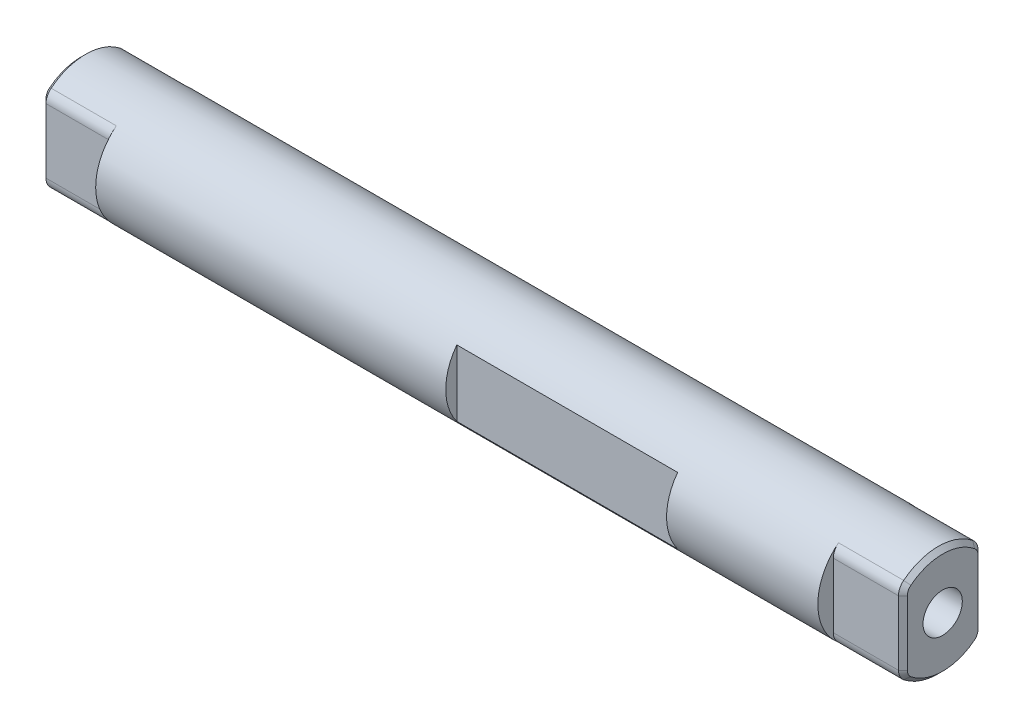
ISO-10303-21;
HEADER;
FILE_DESCRIPTION(('STEP AP214'),'2;1');
FILE_NAME('part.step','',(''),(''),'','','');
FILE_SCHEMA(('AUTOMOTIVE_DESIGN { 1 0 10303 214 1 1 1 1 }'));
ENDSEC;
DATA;
#1=APPLICATION_CONTEXT('core data for automotive mechanical design processes');
#2=APPLICATION_PROTOCOL_DEFINITION('international standard','automotive_design',2000,#1);
#3=PRODUCT_CONTEXT('',#1,'mechanical');
#4=PRODUCT('Part','Part','',(#3));
#5=PRODUCT_RELATED_PRODUCT_CATEGORY('part','',(#4));
#6=PRODUCT_DEFINITION_FORMATION('','',#4);
#7=PRODUCT_DEFINITION_CONTEXT('part definition',#1,'design');
#8=PRODUCT_DEFINITION('design','',#6,#7);
#9=PRODUCT_DEFINITION_SHAPE('','',#8);
#10=(LENGTH_UNIT() NAMED_UNIT(*) SI_UNIT(.MILLI.,.METRE.));
#11=(NAMED_UNIT(*) PLANE_ANGLE_UNIT() SI_UNIT($,.RADIAN.));
#12=(NAMED_UNIT(*) SI_UNIT($,.STERADIAN.) SOLID_ANGLE_UNIT());
#13=UNCERTAINTY_MEASURE_WITH_UNIT(LENGTH_MEASURE(1.E-05),#10,'distance_accuracy_value','');
#14=(GEOMETRIC_REPRESENTATION_CONTEXT(3) GLOBAL_UNCERTAINTY_ASSIGNED_CONTEXT((#13)) GLOBAL_UNIT_ASSIGNED_CONTEXT((#10,
#11,#12)) REPRESENTATION_CONTEXT('',''));
#15=CARTESIAN_POINT('',(0.,0.,0.));
#16=DIRECTION('',(0.,0.,1.));
#17=DIRECTION('',(1.,0.,0.));
#18=AXIS2_PLACEMENT_3D('',#15,#16,#17);
#19=CARTESIAN_POINT('',(-20.7645,0.,0.));
#20=DIRECTION('',(1.,0.,0.));
#21=DIRECTION('',(0.,0.,-1.));
#22=AXIS2_PLACEMENT_3D('',#19,#20,#21);
#23=PLANE('',#22);
#24=CARTESIAN_POINT('',(-20.7645,0.,0.));
#25=DIRECTION('',(1.,0.,0.));
#26=DIRECTION('',(0.,0.,-1.));
#27=AXIS2_PLACEMENT_3D('',#24,#25,#26);
#28=CIRCLE('',#27,3.175);
#29=CARTESIAN_POINT('',(-20.7645,2.47423757055695,1.98966666666667));
#30=VERTEX_POINT('',#29);
#31=CARTESIAN_POINT('',(-20.7645,-2.47423757055695,1.98966666666667));
#32=VERTEX_POINT('',#31);
#33=EDGE_CURVE('E409',#30,#32,#28,.T.);
#34=ORIENTED_EDGE('',*,*,#33,.F.);
#35=CARTESIAN_POINT('',(-20.7645,1.85567817791771,1.49225));
#36=DIRECTION('',(1.,0.,0.));
#37=DIRECTION('',(0.,0.,-1.));
#38=AXIS2_PLACEMENT_3D('',#35,#36,#37);
#39=CIRCLE('',#38,0.79375);
#40=CARTESIAN_POINT('',(-20.7645,1.85567817791771,2.286));
#41=VERTEX_POINT('',#40);
#42=EDGE_CURVE('E290',#30,#41,#39,.T.);
#43=ORIENTED_EDGE('',*,*,#42,.T.);
#44=DIRECTION('',(0.,-1.,0.));
#45=VECTOR('',#44,1.);
#46=CARTESIAN_POINT('',(-20.7645,2.20336764975798,2.286));
#47=LINE('',#46,#45);
#48=CARTESIAN_POINT('',(-20.7645,-1.85567817791771,2.286));
#49=VERTEX_POINT('',#48);
#50=EDGE_CURVE('E306',#41,#49,#47,.T.);
#51=ORIENTED_EDGE('',*,*,#50,.T.);
#52=CARTESIAN_POINT('',(-20.7645,-1.85567817791771,1.49225));
#53=DIRECTION('',(1.,0.,0.));
#54=DIRECTION('',(0.,0.,-1.));
#55=AXIS2_PLACEMENT_3D('',#52,#53,#54);
#56=CIRCLE('',#55,0.79375);
#57=EDGE_CURVE('E292',#49,#32,#56,.T.);
#58=ORIENTED_EDGE('',*,*,#57,.T.);
#59=EDGE_LOOP('',(#34,#43,#51,#58));
#60=FACE_BOUND('',#59,.T.);
#61=ADVANCED_FACE('F39',(#60),#23,.F.);
#62=CARTESIAN_POINT('',(20.7645,0.,0.));
#63=DIRECTION('',(1.,0.,0.));
#64=DIRECTION('',(0.,0.,-1.));
#65=AXIS2_PLACEMENT_3D('',#62,#63,#64);
#66=PLANE('',#65);
#67=DIRECTION('',(0.,1.,0.));
#68=VECTOR('',#67,1.);
#69=CARTESIAN_POINT('',(20.7645,2.20336764975798,-2.286));
#70=LINE('',#69,#68);
#71=CARTESIAN_POINT('',(20.7645,-1.85567817791771,-2.286));
#72=VERTEX_POINT('',#71);
#73=CARTESIAN_POINT('',(20.7645,1.85567817791771,-2.286));
#74=VERTEX_POINT('',#73);
#75=EDGE_CURVE('E334',#72,#74,#70,.T.);
#76=ORIENTED_EDGE('',*,*,#75,.F.);
#77=CARTESIAN_POINT('',(20.7645,-1.85567817791771,-1.49225));
#78=DIRECTION('',(1.,0.,0.));
#79=DIRECTION('',(0.,0.,-1.));
#80=AXIS2_PLACEMENT_3D('',#77,#78,#79);
#81=CIRCLE('',#80,0.79375);
#82=CARTESIAN_POINT('',(20.7645,-2.47423757055695,-1.98966666666667));
#83=VERTEX_POINT('',#82);
#84=EDGE_CURVE('E342',#72,#83,#81,.F.);
#85=ORIENTED_EDGE('',*,*,#84,.T.);
#86=CARTESIAN_POINT('',(20.7645,0.,0.));
#87=DIRECTION('',(1.,0.,0.));
#88=DIRECTION('',(0.,0.,-1.));
#89=AXIS2_PLACEMENT_3D('',#86,#87,#88);
#90=CIRCLE('',#89,3.175);
#91=CARTESIAN_POINT('',(20.7645,2.47423757055695,-1.98966666666667));
#92=VERTEX_POINT('',#91);
#93=EDGE_CURVE('E912',#83,#92,#90,.T.);
#94=ORIENTED_EDGE('',*,*,#93,.T.);
#95=CARTESIAN_POINT('',(20.7645,1.85567817791771,-1.49225));
#96=DIRECTION('',(1.,0.,0.));
#97=DIRECTION('',(0.,0.,-1.));
#98=AXIS2_PLACEMENT_3D('',#95,#96,#97);
#99=CIRCLE('',#98,0.79375);
#100=EDGE_CURVE('E345',#92,#74,#99,.F.);
#101=ORIENTED_EDGE('',*,*,#100,.T.);
#102=EDGE_LOOP('',(#76,#85,#94,#101));
#103=FACE_BOUND('',#102,.T.);
#104=ADVANCED_FACE('F474',(#103),#66,.T.);
#105=CARTESIAN_POINT('',(20.7645,0.,0.));
#106=DIRECTION('',(-1.,0.,0.));
#107=DIRECTION('',(0.,0.,1.));
#108=AXIS2_PLACEMENT_3D('',#105,#106,#107);
#109=CYLINDRICAL_SURFACE('',#108,3.175);
#110=DIRECTION('',(-1.,0.,0.));
#111=VECTOR('',#110,1.);
#112=CARTESIAN_POINT('',(20.7645,1.905,2.54));
#113=LINE('',#112,#111);
#114=CARTESIAN_POINT('',(-0.635,1.905,2.54));
#115=VERTEX_POINT('',#114);
#116=CARTESIAN_POINT('',(12.065,1.905,2.54));
#117=VERTEX_POINT('',#116);
#118=EDGE_CURVE('E11',#115,#117,#113,.F.);
#119=ORIENTED_EDGE('',*,*,#118,.T.);
#120=CARTESIAN_POINT('',(12.065,0.,0.));
#121=DIRECTION('',(1.,0.,0.));
#122=DIRECTION('',(0.,0.,-1.));
#123=AXIS2_PLACEMENT_3D('',#120,#121,#122);
#124=CIRCLE('',#123,3.175);
#125=CARTESIAN_POINT('',(12.065,-1.905,2.54));
#126=VERTEX_POINT('',#125);
#127=EDGE_CURVE('E53',#117,#126,#124,.T.);
#128=ORIENTED_EDGE('',*,*,#127,.T.);
#129=DIRECTION('',(-1.,0.,0.));
#130=VECTOR('',#129,1.);
#131=CARTESIAN_POINT('',(20.7645,-1.905,2.54));
#132=LINE('',#131,#130);
#133=CARTESIAN_POINT('',(-0.635,-1.905,2.54));
#134=VERTEX_POINT('',#133);
#135=EDGE_CURVE('E47',#126,#134,#132,.T.);
#136=ORIENTED_EDGE('',*,*,#135,.T.);
#137=CARTESIAN_POINT('',(-0.635,0.,0.));
#138=DIRECTION('',(-1.,0.,0.));
#139=DIRECTION('',(0.,0.,1.));
#140=AXIS2_PLACEMENT_3D('',#137,#138,#139);
#141=CIRCLE('',#140,3.175);
#142=EDGE_CURVE('E230',#134,#115,#141,.T.);
#143=ORIENTED_EDGE('',*,*,#142,.T.);
#144=EDGE_LOOP('',(#119,#128,#136,#143));
#145=FACE_BOUND('',#144,.T.);
#146=DIRECTION('',(-1.,0.,0.));
#147=VECTOR('',#146,1.);
#148=CARTESIAN_POINT('',(20.7645,-2.47423757055695,-1.98966666666667));
#149=LINE('',#148,#147);
#150=CARTESIAN_POINT('',(24.511,-2.47423757055695,-1.98966666666667));
#151=VERTEX_POINT('',#150);
#152=EDGE_CURVE('E335',#83,#151,#149,.F.);
#153=ORIENTED_EDGE('',*,*,#152,.T.);
#154=CARTESIAN_POINT('',(24.511,0.,0.));
#155=DIRECTION('',(1.,0.,0.));
#156=DIRECTION('',(0.,0.,-1.));
#157=AXIS2_PLACEMENT_3D('',#154,#155,#156);
#158=CIRCLE('',#157,3.175);
#159=CARTESIAN_POINT('',(24.511,-2.47423757055695,1.98966666666667));
#160=VERTEX_POINT('',#159);
#161=EDGE_CURVE('E378',#151,#160,#158,.F.);
#162=ORIENTED_EDGE('',*,*,#161,.T.);
#163=DIRECTION('',(-1.,0.,0.));
#164=VECTOR('',#163,1.);
#165=CARTESIAN_POINT('',(20.7645,-2.47423757055695,1.98966666666667));
#166=LINE('',#165,#164);
#167=CARTESIAN_POINT('',(20.7645,-2.47423757055695,1.98966666666667));
#168=VERTEX_POINT('',#167);
#169=EDGE_CURVE('E899',#160,#168,#166,.T.);
#170=ORIENTED_EDGE('',*,*,#169,.T.);
#171=CARTESIAN_POINT('',(20.7645,2.47423757055695,1.98966666666667));
#172=VERTEX_POINT('',#171);
#173=EDGE_CURVE('E910',#172,#168,#90,.T.);
#174=ORIENTED_EDGE('',*,*,#173,.F.);
#175=DIRECTION('',(-1.,0.,0.));
#176=VECTOR('',#175,1.);
#177=CARTESIAN_POINT('',(20.7645,2.47423757055695,1.98966666666667));
#178=LINE('',#177,#176);
#179=CARTESIAN_POINT('',(24.511,2.47423757055695,1.98966666666667));
#180=VERTEX_POINT('',#179);
#181=EDGE_CURVE('E886',#172,#180,#178,.F.);
#182=ORIENTED_EDGE('',*,*,#181,.T.);
#183=CARTESIAN_POINT('',(24.511,0.,0.));
#184=DIRECTION('',(1.,0.,0.));
#185=DIRECTION('',(0.,0.,-1.));
#186=AXIS2_PLACEMENT_3D('',#183,#184,#185);
#187=CIRCLE('',#186,3.175);
#188=CARTESIAN_POINT('',(24.511,2.47423757055695,-1.98966666666667));
#189=VERTEX_POINT('',#188);
#190=EDGE_CURVE('E376',#180,#189,#187,.F.);
#191=ORIENTED_EDGE('',*,*,#190,.T.);
#192=DIRECTION('',(-1.,0.,0.));
#193=VECTOR('',#192,1.);
#194=CARTESIAN_POINT('',(20.7645,2.47423757055695,-1.98966666666667));
#195=LINE('',#194,#193);
#196=EDGE_CURVE('E903',#189,#92,#195,.T.);
#197=ORIENTED_EDGE('',*,*,#196,.T.);
#198=ORIENTED_EDGE('',*,*,#93,.F.);
#199=EDGE_LOOP('',(#153,#162,#170,#174,#182,#191,#197,#198));
#200=FACE_BOUND('',#199,.T.);
#201=DIRECTION('',(-1.,0.,0.));
#202=VECTOR('',#201,1.);
#203=CARTESIAN_POINT('',(20.7645,-2.47423757055695,1.98966666666667));
#204=LINE('',#203,#202);
#205=CARTESIAN_POINT('',(-24.511,-2.47423757055695,1.98966666666667));
#206=VERTEX_POINT('',#205);
#207=EDGE_CURVE('E415',#32,#206,#204,.T.);
#208=ORIENTED_EDGE('',*,*,#207,.T.);
#209=CARTESIAN_POINT('',(-24.511,0.,0.));
#210=DIRECTION('',(-1.,0.,0.));
#211=DIRECTION('',(0.,0.,1.));
#212=AXIS2_PLACEMENT_3D('',#209,#210,#211);
#213=CIRCLE('',#212,3.175);
#214=CARTESIAN_POINT('',(-24.511,-2.47423757055695,-1.98966666666667));
#215=VERTEX_POINT('',#214);
#216=EDGE_CURVE('E262',#206,#215,#213,.F.);
#217=ORIENTED_EDGE('',*,*,#216,.T.);
#218=DIRECTION('',(-1.,0.,0.));
#219=VECTOR('',#218,1.);
#220=CARTESIAN_POINT('',(20.7645,-2.47423757055695,-1.98966666666667));
#221=LINE('',#220,#219);
#222=CARTESIAN_POINT('',(-20.7645,-2.47423757055695,-1.98966666666667));
#223=VERTEX_POINT('',#222);
#224=EDGE_CURVE('E421',#215,#223,#221,.F.);
#225=ORIENTED_EDGE('',*,*,#224,.T.);
#226=CARTESIAN_POINT('',(-20.7645,2.47423757055695,-1.98966666666667));
#227=VERTEX_POINT('',#226);
#228=EDGE_CURVE('E412',#223,#227,#28,.T.);
#229=ORIENTED_EDGE('',*,*,#228,.T.);
#230=DIRECTION('',(-1.,0.,0.));
#231=VECTOR('',#230,1.);
#232=CARTESIAN_POINT('',(20.7645,2.47423757055695,-1.98966666666667));
#233=LINE('',#232,#231);
#234=CARTESIAN_POINT('',(-24.511,2.47423757055695,-1.98966666666667));
#235=VERTEX_POINT('',#234);
#236=EDGE_CURVE('E418',#227,#235,#233,.T.);
#237=ORIENTED_EDGE('',*,*,#236,.T.);
#238=CARTESIAN_POINT('',(-24.511,0.,0.));
#239=DIRECTION('',(-1.,0.,0.));
#240=DIRECTION('',(0.,0.,1.));
#241=AXIS2_PLACEMENT_3D('',#238,#239,#240);
#242=CIRCLE('',#241,3.175);
#243=CARTESIAN_POINT('',(-24.511,2.47423757055695,1.98966666666667));
#244=VERTEX_POINT('',#243);
#245=EDGE_CURVE('E264',#235,#244,#242,.F.);
#246=ORIENTED_EDGE('',*,*,#245,.T.);
#247=DIRECTION('',(-1.,0.,0.));
#248=VECTOR('',#247,1.);
#249=CARTESIAN_POINT('',(20.7645,2.47423757055695,1.98966666666667));
#250=LINE('',#249,#248);
#251=EDGE_CURVE('E386',#244,#30,#250,.F.);
#252=ORIENTED_EDGE('',*,*,#251,.T.);
#253=ORIENTED_EDGE('',*,*,#33,.T.);
#254=EDGE_LOOP('',(#208,#217,#225,#229,#237,#246,#252,#253));
#255=FACE_BOUND('',#254,.T.);
#256=ADVANCED_FACE('F228',(#145,#200,#255),#109,.T.);
#257=DIRECTION('',(0.,-1.,0.));
#258=VECTOR('',#257,1.);
#259=CARTESIAN_POINT('',(20.7645,2.20336764975798,2.286));
#260=LINE('',#259,#258);
#261=CARTESIAN_POINT('',(20.7645,1.85567817791771,2.286));
#262=VERTEX_POINT('',#261);
#263=CARTESIAN_POINT('',(20.7645,-1.85567817791771,2.286));
#264=VERTEX_POINT('',#263);
#265=EDGE_CURVE('E325',#262,#264,#260,.T.);
#266=ORIENTED_EDGE('',*,*,#265,.F.);
#267=CARTESIAN_POINT('',(20.7645,1.85567817791771,1.49225));
#268=DIRECTION('',(1.,0.,0.));
#269=DIRECTION('',(0.,0.,-1.));
#270=AXIS2_PLACEMENT_3D('',#267,#268,#269);
#271=CIRCLE('',#270,0.79375);
#272=EDGE_CURVE('E349',#262,#172,#271,.F.);
#273=ORIENTED_EDGE('',*,*,#272,.T.);
#274=ORIENTED_EDGE('',*,*,#173,.T.);
#275=CARTESIAN_POINT('',(20.7645,-1.85567817791771,1.49225));
#276=DIRECTION('',(1.,0.,0.));
#277=DIRECTION('',(0.,0.,-1.));
#278=AXIS2_PLACEMENT_3D('',#275,#276,#277);
#279=CIRCLE('',#278,0.79375);
#280=EDGE_CURVE('E347',#168,#264,#279,.F.);
#281=ORIENTED_EDGE('',*,*,#280,.T.);
#282=EDGE_LOOP('',(#266,#273,#274,#281));
#283=FACE_BOUND('',#282,.T.);
#284=ADVANCED_FACE('F482',(#283),#66,.T.);
#285=ORIENTED_EDGE('',*,*,#228,.F.);
#286=CARTESIAN_POINT('',(-20.7645,-1.85567817791771,-1.49225));
#287=DIRECTION('',(1.,0.,0.));
#288=DIRECTION('',(0.,0.,-1.));
#289=AXIS2_PLACEMENT_3D('',#286,#287,#288);
#290=CIRCLE('',#289,0.79375);
#291=CARTESIAN_POINT('',(-20.7645,-1.85567817791771,-2.286));
#292=VERTEX_POINT('',#291);
#293=EDGE_CURVE('E298',#223,#292,#290,.T.);
#294=ORIENTED_EDGE('',*,*,#293,.T.);
#295=DIRECTION('',(0.,1.,0.));
#296=VECTOR('',#295,1.);
#297=CARTESIAN_POINT('',(-20.7645,2.20336764975798,-2.286));
#298=LINE('',#297,#296);
#299=CARTESIAN_POINT('',(-20.7645,1.85567817791771,-2.286));
#300=VERTEX_POINT('',#299);
#301=EDGE_CURVE('E311',#292,#300,#298,.T.);
#302=ORIENTED_EDGE('',*,*,#301,.T.);
#303=CARTESIAN_POINT('',(-20.7645,1.85567817791771,-1.49225));
#304=DIRECTION('',(1.,0.,0.));
#305=DIRECTION('',(0.,0.,-1.));
#306=AXIS2_PLACEMENT_3D('',#303,#304,#305);
#307=CIRCLE('',#306,0.79375);
#308=EDGE_CURVE('E295',#300,#227,#307,.T.);
#309=ORIENTED_EDGE('',*,*,#308,.T.);
#310=EDGE_LOOP('',(#285,#294,#302,#309));
#311=FACE_BOUND('',#310,.T.);
#312=ADVANCED_FACE('F460',(#311),#23,.F.);
#313=CARTESIAN_POINT('',(24.765,2.20336764975798,2.286));
#314=DIRECTION('',(0.,0.,-1.));
#315=DIRECTION('',(-1.,0.,0.));
#316=AXIS2_PLACEMENT_3D('',#313,#314,#315);
#317=PLANE('',#316);
#318=DIRECTION('',(-1.,0.,0.));
#319=VECTOR('',#318,1.);
#320=CARTESIAN_POINT('',(24.765,-1.85567817791771,2.286));
#321=LINE('',#320,#319);
#322=CARTESIAN_POINT('',(24.511,-1.85567817791771,2.286));
#323=VERTEX_POINT('',#322);
#324=EDGE_CURVE('E339',#264,#323,#321,.F.);
#325=ORIENTED_EDGE('',*,*,#324,.T.);
#326=DIRECTION('',(0.,1.,0.));
#327=VECTOR('',#326,1.);
#328=CARTESIAN_POINT('',(24.511,1.85567817791771,2.286));
#329=LINE('',#328,#327);
#330=CARTESIAN_POINT('',(24.511,1.85567817791771,2.286));
#331=VERTEX_POINT('',#330);
#332=EDGE_CURVE('E369',#323,#331,#329,.T.);
#333=ORIENTED_EDGE('',*,*,#332,.T.);
#334=DIRECTION('',(-1.,0.,0.));
#335=VECTOR('',#334,1.);
#336=CARTESIAN_POINT('',(24.765,1.85567817791771,2.286));
#337=LINE('',#336,#335);
#338=EDGE_CURVE('E337',#331,#262,#337,.T.);
#339=ORIENTED_EDGE('',*,*,#338,.T.);
#340=ORIENTED_EDGE('',*,*,#265,.T.);
#341=EDGE_LOOP('',(#325,#333,#339,#340));
#342=FACE_BOUND('',#341,.T.);
#343=ADVANCED_FACE('F486',(#342),#317,.F.);
#344=CARTESIAN_POINT('',(24.765,2.20336764975798,-2.286));
#345=DIRECTION('',(0.,0.,1.));
#346=DIRECTION('',(1.,0.,0.));
#347=AXIS2_PLACEMENT_3D('',#344,#345,#346);
#348=PLANE('',#347);
#349=DIRECTION('',(-1.,0.,0.));
#350=VECTOR('',#349,1.);
#351=CARTESIAN_POINT('',(24.765,1.85567817791771,-2.286));
#352=LINE('',#351,#350);
#353=CARTESIAN_POINT('',(24.511,1.85567817791771,-2.286));
#354=VERTEX_POINT('',#353);
#355=EDGE_CURVE('E887',#74,#354,#352,.F.);
#356=ORIENTED_EDGE('',*,*,#355,.T.);
#357=DIRECTION('',(0.,-1.,0.));
#358=VECTOR('',#357,1.);
#359=CARTESIAN_POINT('',(24.511,-1.85567817791771,-2.286));
#360=LINE('',#359,#358);
#361=CARTESIAN_POINT('',(24.511,-1.85567817791771,-2.286));
#362=VERTEX_POINT('',#361);
#363=EDGE_CURVE('E384',#354,#362,#360,.T.);
#364=ORIENTED_EDGE('',*,*,#363,.T.);
#365=DIRECTION('',(-1.,0.,0.));
#366=VECTOR('',#365,1.);
#367=CARTESIAN_POINT('',(24.765,-1.85567817791771,-2.286));
#368=LINE('',#367,#366);
#369=EDGE_CURVE('E879',#362,#72,#368,.T.);
#370=ORIENTED_EDGE('',*,*,#369,.T.);
#371=ORIENTED_EDGE('',*,*,#75,.T.);
#372=EDGE_LOOP('',(#356,#364,#370,#371));
#373=FACE_BOUND('',#372,.T.);
#374=ADVANCED_FACE('F491',(#373),#348,.F.);
#375=CARTESIAN_POINT('',(24.765,0.,0.));
#376=DIRECTION('',(1.,0.,0.));
#377=DIRECTION('',(0.,0.,-1.));
#378=AXIS2_PLACEMENT_3D('',#375,#376,#377);
#379=PLANE('',#378);
#380=CARTESIAN_POINT('',(24.765,1.85567817791771,1.49225));
#381=DIRECTION('',(1.,0.,0.));
#382=DIRECTION('',(0.,0.,-1.));
#383=AXIS2_PLACEMENT_3D('',#380,#381,#382);
#384=CIRCLE('',#383,0.539749999999996);
#385=CARTESIAN_POINT('',(24.765,2.27629856491239,1.83049333333333));
#386=VERTEX_POINT('',#385);
#387=CARTESIAN_POINT('',(24.765,1.85567817791771,2.032));
#388=VERTEX_POINT('',#387);
#389=EDGE_CURVE('E362',#386,#388,#384,.T.);
#390=ORIENTED_EDGE('',*,*,#389,.T.);
#391=DIRECTION('',(0.,-1.,0.));
#392=VECTOR('',#391,1.);
#393=CARTESIAN_POINT('',(24.765,-1.85567817791771,2.032));
#394=LINE('',#393,#392);
#395=CARTESIAN_POINT('',(24.765,-1.85567817791771,2.032));
#396=VERTEX_POINT('',#395);
#397=EDGE_CURVE('E366',#388,#396,#394,.T.);
#398=ORIENTED_EDGE('',*,*,#397,.T.);
#399=CARTESIAN_POINT('',(24.765,-1.85567817791771,1.49225));
#400=DIRECTION('',(1.,0.,0.));
#401=DIRECTION('',(0.,0.,-1.));
#402=AXIS2_PLACEMENT_3D('',#399,#400,#401);
#403=CIRCLE('',#402,0.539749999999996);
#404=CARTESIAN_POINT('',(24.765,-2.27629856491239,1.83049333333333));
#405=VERTEX_POINT('',#404);
#406=EDGE_CURVE('E364',#396,#405,#403,.T.);
#407=ORIENTED_EDGE('',*,*,#406,.T.);
#408=CARTESIAN_POINT('',(24.765,0.,0.));
#409=DIRECTION('',(1.,0.,0.));
#410=DIRECTION('',(0.,0.,-1.));
#411=AXIS2_PLACEMENT_3D('',#408,#409,#410);
#412=CIRCLE('',#411,2.921);
#413=CARTESIAN_POINT('',(24.765,-2.27629856491239,-1.83049333333333));
#414=VERTEX_POINT('',#413);
#415=EDGE_CURVE('E360',#405,#414,#412,.T.);
#416=ORIENTED_EDGE('',*,*,#415,.T.);
#417=CARTESIAN_POINT('',(24.765,-1.85567817791771,-1.49225));
#418=DIRECTION('',(1.,0.,0.));
#419=DIRECTION('',(0.,0.,-1.));
#420=AXIS2_PLACEMENT_3D('',#417,#418,#419);
#421=CIRCLE('',#420,0.539749999999996);
#422=CARTESIAN_POINT('',(24.765,-1.85567817791771,-2.032));
#423=VERTEX_POINT('',#422);
#424=EDGE_CURVE('E356',#414,#423,#421,.T.);
#425=ORIENTED_EDGE('',*,*,#424,.T.);
#426=DIRECTION('',(0.,1.,0.));
#427=VECTOR('',#426,1.);
#428=CARTESIAN_POINT('',(24.765,1.85567817791771,-2.032));
#429=LINE('',#428,#427);
#430=CARTESIAN_POINT('',(24.765,1.85567817791771,-2.032));
#431=VERTEX_POINT('',#430);
#432=EDGE_CURVE('E352',#423,#431,#429,.T.);
#433=ORIENTED_EDGE('',*,*,#432,.T.);
#434=CARTESIAN_POINT('',(24.765,1.85567817791771,-1.49225));
#435=DIRECTION('',(1.,0.,0.));
#436=DIRECTION('',(0.,0.,-1.));
#437=AXIS2_PLACEMENT_3D('',#434,#435,#436);
#438=CIRCLE('',#437,0.539749999999996);
#439=CARTESIAN_POINT('',(24.765,2.27629856491239,-1.83049333333333));
#440=VERTEX_POINT('',#439);
#441=EDGE_CURVE('E354',#431,#440,#438,.T.);
#442=ORIENTED_EDGE('',*,*,#441,.T.);
#443=CARTESIAN_POINT('',(24.765,0.,0.));
#444=DIRECTION('',(1.,0.,0.));
#445=DIRECTION('',(0.,0.,-1.));
#446=AXIS2_PLACEMENT_3D('',#443,#444,#445);
#447=CIRCLE('',#446,2.921);
#448=EDGE_CURVE('E358',#440,#386,#447,.T.);
#449=ORIENTED_EDGE('',*,*,#448,.T.);
#450=EDGE_LOOP('',(#390,#398,#407,#416,#425,#433,#442,#449));
#451=FACE_BOUND('',#450,.T.);
#452=CARTESIAN_POINT('',(24.765,0.,0.));
#453=DIRECTION('',(1.,0.,0.));
#454=DIRECTION('',(0.,0.,-1.));
#455=AXIS2_PLACEMENT_3D('',#452,#453,#454);
#456=CIRCLE('',#455,1.1303);
#457=CARTESIAN_POINT('',(24.765,0.,-1.1303));
#458=VERTEX_POINT('',#457);
#459=EDGE_CURVE('E318',#458,#458,#456,.T.);
#460=ORIENTED_EDGE('',*,*,#459,.F.);
#461=EDGE_LOOP('',(#460));
#462=FACE_BOUND('',#461,.T.);
#463=ADVANCED_FACE('F502',(#451,#462),#379,.T.);
#464=CARTESIAN_POINT('',(20.7645,-1.85567817791771,-1.49225));
#465=DIRECTION('',(-1.,0.,0.));
#466=DIRECTION('',(0.,0.,1.));
#467=AXIS2_PLACEMENT_3D('',#464,#465,#466);
#468=CYLINDRICAL_SURFACE('',#467,0.79375);
#469=ORIENTED_EDGE('',*,*,#369,.F.);
#470=CARTESIAN_POINT('',(24.511,-1.85567817791771,-1.49225));
#471=DIRECTION('',(1.,0.,0.));
#472=DIRECTION('',(0.,0.,-1.));
#473=AXIS2_PLACEMENT_3D('',#470,#471,#472);
#474=CIRCLE('',#473,0.79375);
#475=EDGE_CURVE('E380',#362,#151,#474,.F.);
#476=ORIENTED_EDGE('',*,*,#475,.T.);
#477=ORIENTED_EDGE('',*,*,#152,.F.);
#478=ORIENTED_EDGE('',*,*,#84,.F.);
#479=EDGE_LOOP('',(#469,#476,#477,#478));
#480=FACE_BOUND('',#479,.T.);
#481=ADVANCED_FACE('F506',(#480),#468,.T.);
#482=CARTESIAN_POINT('',(20.7645,1.85567817791771,-1.49225));
#483=DIRECTION('',(-1.,0.,0.));
#484=DIRECTION('',(0.,0.,1.));
#485=AXIS2_PLACEMENT_3D('',#482,#483,#484);
#486=CYLINDRICAL_SURFACE('',#485,0.79375);
#487=ORIENTED_EDGE('',*,*,#196,.F.);
#488=CARTESIAN_POINT('',(24.511,1.85567817791771,-1.49225));
#489=DIRECTION('',(1.,0.,0.));
#490=DIRECTION('',(0.,0.,-1.));
#491=AXIS2_PLACEMENT_3D('',#488,#489,#490);
#492=CIRCLE('',#491,0.79375);
#493=EDGE_CURVE('E382',#189,#354,#492,.F.);
#494=ORIENTED_EDGE('',*,*,#493,.T.);
#495=ORIENTED_EDGE('',*,*,#355,.F.);
#496=ORIENTED_EDGE('',*,*,#100,.F.);
#497=EDGE_LOOP('',(#487,#494,#495,#496));
#498=FACE_BOUND('',#497,.T.);
#499=ADVANCED_FACE('F767',(#498),#486,.T.);
#500=CARTESIAN_POINT('',(20.7645,-1.85567817791771,1.49225));
#501=DIRECTION('',(-1.,0.,0.));
#502=DIRECTION('',(0.,0.,1.));
#503=AXIS2_PLACEMENT_3D('',#500,#501,#502);
#504=CYLINDRICAL_SURFACE('',#503,0.79375);
#505=ORIENTED_EDGE('',*,*,#169,.F.);
#506=CARTESIAN_POINT('',(24.511,-1.85567817791771,1.49225));
#507=DIRECTION('',(1.,0.,0.));
#508=DIRECTION('',(0.,0.,-1.));
#509=AXIS2_PLACEMENT_3D('',#506,#507,#508);
#510=CIRCLE('',#509,0.79375);
#511=EDGE_CURVE('E372',#160,#323,#510,.F.);
#512=ORIENTED_EDGE('',*,*,#511,.T.);
#513=ORIENTED_EDGE('',*,*,#324,.F.);
#514=ORIENTED_EDGE('',*,*,#280,.F.);
#515=EDGE_LOOP('',(#505,#512,#513,#514));
#516=FACE_BOUND('',#515,.T.);
#517=ADVANCED_FACE('F756',(#516),#504,.T.);
#518=CARTESIAN_POINT('',(20.7645,1.85567817791771,1.49225));
#519=DIRECTION('',(-1.,0.,0.));
#520=DIRECTION('',(0.,0.,1.));
#521=AXIS2_PLACEMENT_3D('',#518,#519,#520);
#522=CYLINDRICAL_SURFACE('',#521,0.79375);
#523=ORIENTED_EDGE('',*,*,#338,.F.);
#524=CARTESIAN_POINT('',(24.511,1.85567817791771,1.49225));
#525=DIRECTION('',(1.,0.,0.));
#526=DIRECTION('',(0.,0.,-1.));
#527=AXIS2_PLACEMENT_3D('',#524,#525,#526);
#528=CIRCLE('',#527,0.79375);
#529=EDGE_CURVE('E374',#331,#180,#528,.F.);
#530=ORIENTED_EDGE('',*,*,#529,.T.);
#531=ORIENTED_EDGE('',*,*,#181,.F.);
#532=ORIENTED_EDGE('',*,*,#272,.F.);
#533=EDGE_LOOP('',(#523,#530,#531,#532));
#534=FACE_BOUND('',#533,.T.);
#535=ADVANCED_FACE('F512',(#534),#522,.T.);
#536=CARTESIAN_POINT('',(17.145,0.,0.));
#537=DIRECTION('',(1.,0.,0.));
#538=DIRECTION('',(0.,0.,-1.));
#539=AXIS2_PLACEMENT_3D('',#536,#537,#538);
#540=CONICAL_SURFACE('',#539,1.1303,1.02974425867665);
#541=CARTESIAN_POINT('',(16.4658472423131,0.,0.));
#542=VERTEX_POINT('',#541);
#543=VERTEX_LOOP('',#542);
#544=FACE_BOUND('',#543,.T.);
#545=CARTESIAN_POINT('',(17.145,0.,0.));
#546=DIRECTION('',(1.,0.,0.));
#547=DIRECTION('',(0.,0.,-1.));
#548=AXIS2_PLACEMENT_3D('',#545,#546,#547);
#549=CIRCLE('',#548,1.1303);
#550=CARTESIAN_POINT('',(17.145,0.,-1.1303));
#551=VERTEX_POINT('',#550);
#552=EDGE_CURVE('E321',#551,#551,#549,.T.);
#553=ORIENTED_EDGE('',*,*,#552,.T.);
#554=EDGE_LOOP('',(#553));
#555=FACE_BOUND('',#554,.T.);
#556=ADVANCED_FACE('F508',(#544,#555),#540,.F.);
#557=CARTESIAN_POINT('',(24.765,0.,0.));
#558=DIRECTION('',(1.,0.,0.));
#559=DIRECTION('',(0.,0.,-1.));
#560=AXIS2_PLACEMENT_3D('',#557,#558,#559);
#561=CYLINDRICAL_SURFACE('',#560,1.1303);
#562=ORIENTED_EDGE('',*,*,#552,.F.);
#563=EDGE_LOOP('',(#562));
#564=FACE_BOUND('',#563,.T.);
#565=ORIENTED_EDGE('',*,*,#459,.T.);
#566=EDGE_LOOP('',(#565));
#567=FACE_BOUND('',#566,.T.);
#568=ADVANCED_FACE('F511',(#564,#567),#561,.F.);
#569=CARTESIAN_POINT('',(24.765,0.,-2.032));
#570=DIRECTION('',(0.707106781186538,0.,-0.707106781186557));
#571=DIRECTION('',(-0.707106781186557,0.,-0.707106781186538));
#572=AXIS2_PLACEMENT_3D('',#569,#570,#571);
#573=PLANE('',#572);
#574=DIRECTION('',(0.707106781186557,0.,0.707106781186538));
#575=VECTOR('',#574,1.);
#576=CARTESIAN_POINT('',(24.511,-1.85567817791771,-2.286));
#577=LINE('',#576,#575);
#578=EDGE_CURVE('E402',#362,#423,#577,.T.);
#579=ORIENTED_EDGE('',*,*,#578,.F.);
#580=ORIENTED_EDGE('',*,*,#363,.F.);
#581=DIRECTION('',(-0.707106781186557,0.,-0.707106781186538));
#582=VECTOR('',#581,1.);
#583=CARTESIAN_POINT('',(24.765,1.85567817791771,-2.032));
#584=LINE('',#583,#582);
#585=EDGE_CURVE('E322',#431,#354,#584,.T.);
#586=ORIENTED_EDGE('',*,*,#585,.F.);
#587=ORIENTED_EDGE('',*,*,#432,.F.);
#588=EDGE_LOOP('',(#579,#580,#586,#587));
#589=FACE_BOUND('',#588,.T.);
#590=ADVANCED_FACE('F516',(#589),#573,.T.);
#591=CARTESIAN_POINT('',(24.765,1.85567817791771,-1.49225));
#592=DIRECTION('',(-1.,0.,0.));
#593=DIRECTION('',(0.,0.,1.));
#594=AXIS2_PLACEMENT_3D('',#591,#592,#593);
#595=CONICAL_SURFACE('',#594,0.539749999999996,0.785398163397435);
#596=ORIENTED_EDGE('',*,*,#585,.T.);
#597=ORIENTED_EDGE('',*,*,#493,.F.);
#598=DIRECTION('',(-0.707106781186557,0.551039421860574,-0.443120249543564));
#599=VECTOR('',#598,1.);
#600=CARTESIAN_POINT('',(24.765,2.27629856491239,-1.83049333333333));
#601=LINE('',#600,#599);
#602=EDGE_CURVE('E399',#440,#189,#601,.T.);
#603=ORIENTED_EDGE('',*,*,#602,.F.);
#604=ORIENTED_EDGE('',*,*,#441,.F.);
#605=EDGE_LOOP('',(#596,#597,#603,#604));
#606=FACE_BOUND('',#605,.T.);
#607=ADVANCED_FACE('F728',(#606),#595,.T.);
#608=CARTESIAN_POINT('',(24.765,-1.85567817791771,-1.49225));
#609=DIRECTION('',(-1.,0.,0.));
#610=DIRECTION('',(0.,0.,1.));
#611=AXIS2_PLACEMENT_3D('',#608,#609,#610);
#612=CONICAL_SURFACE('',#611,0.539749999999996,0.785398163397435);
#613=ORIENTED_EDGE('',*,*,#578,.T.);
#614=ORIENTED_EDGE('',*,*,#424,.F.);
#615=DIRECTION('',(0.707106781186557,0.551039421860574,0.443120249543564));
#616=VECTOR('',#615,1.);
#617=CARTESIAN_POINT('',(24.511,-2.47423757055695,-1.98966666666667));
#618=LINE('',#617,#616);
#619=EDGE_CURVE('E396',#151,#414,#618,.T.);
#620=ORIENTED_EDGE('',*,*,#619,.F.);
#621=ORIENTED_EDGE('',*,*,#475,.F.);
#622=EDGE_LOOP('',(#613,#614,#620,#621));
#623=FACE_BOUND('',#622,.T.);
#624=ADVANCED_FACE('F718',(#623),#612,.T.);
#625=CARTESIAN_POINT('',(24.765,0.,0.));
#626=DIRECTION('',(-1.,0.,0.));
#627=DIRECTION('',(0.,0.,1.));
#628=AXIS2_PLACEMENT_3D('',#625,#626,#627);
#629=CONICAL_SURFACE('',#628,2.921,0.785398163397434);
#630=ORIENTED_EDGE('',*,*,#602,.T.);
#631=ORIENTED_EDGE('',*,*,#190,.F.);
#632=DIRECTION('',(-0.707106781186559,0.551039421860573,0.443120249543563));
#633=VECTOR('',#632,1.);
#634=CARTESIAN_POINT('',(24.765,2.27629856491239,1.83049333333333));
#635=LINE('',#634,#633);
#636=EDGE_CURVE('E393',#386,#180,#635,.T.);
#637=ORIENTED_EDGE('',*,*,#636,.F.);
#638=ORIENTED_EDGE('',*,*,#448,.F.);
#639=EDGE_LOOP('',(#630,#631,#637,#638));
#640=FACE_BOUND('',#639,.T.);
#641=ADVANCED_FACE('F708',(#640),#629,.T.);
#642=CARTESIAN_POINT('',(24.765,0.,0.));
#643=DIRECTION('',(-1.,0.,0.));
#644=DIRECTION('',(0.,0.,1.));
#645=AXIS2_PLACEMENT_3D('',#642,#643,#644);
#646=CONICAL_SURFACE('',#645,2.921,0.785398163397435);
#647=ORIENTED_EDGE('',*,*,#619,.T.);
#648=ORIENTED_EDGE('',*,*,#415,.F.);
#649=DIRECTION('',(0.707106781186559,0.551039421860573,-0.443120249543563));
#650=VECTOR('',#649,1.);
#651=CARTESIAN_POINT('',(24.511,-2.47423757055695,1.98966666666667));
#652=LINE('',#651,#650);
#653=EDGE_CURVE('E390',#160,#405,#652,.T.);
#654=ORIENTED_EDGE('',*,*,#653,.F.);
#655=ORIENTED_EDGE('',*,*,#161,.F.);
#656=EDGE_LOOP('',(#647,#648,#654,#655));
#657=FACE_BOUND('',#656,.T.);
#658=ADVANCED_FACE('F698',(#657),#646,.T.);
#659=CARTESIAN_POINT('',(24.765,1.85567817791771,1.49225));
#660=DIRECTION('',(-1.,0.,0.));
#661=DIRECTION('',(0.,0.,1.));
#662=AXIS2_PLACEMENT_3D('',#659,#660,#661);
#663=CONICAL_SURFACE('',#662,0.539749999999996,0.785398163397435);
#664=ORIENTED_EDGE('',*,*,#636,.T.);
#665=ORIENTED_EDGE('',*,*,#529,.F.);
#666=DIRECTION('',(-0.707106781186557,0.,0.707106781186538));
#667=VECTOR('',#666,1.);
#668=CARTESIAN_POINT('',(24.765,1.85567817791771,2.032));
#669=LINE('',#668,#667);
#670=EDGE_CURVE('E388',#388,#331,#669,.T.);
#671=ORIENTED_EDGE('',*,*,#670,.F.);
#672=ORIENTED_EDGE('',*,*,#389,.F.);
#673=EDGE_LOOP('',(#664,#665,#671,#672));
#674=FACE_BOUND('',#673,.T.);
#675=ADVANCED_FACE('F688',(#674),#663,.T.);
#676=CARTESIAN_POINT('',(24.765,-1.85567817791771,1.49225));
#677=DIRECTION('',(-1.,0.,0.));
#678=DIRECTION('',(0.,0.,1.));
#679=AXIS2_PLACEMENT_3D('',#676,#677,#678);
#680=CONICAL_SURFACE('',#679,0.539749999999996,0.785398163397435);
#681=ORIENTED_EDGE('',*,*,#653,.T.);
#682=ORIENTED_EDGE('',*,*,#406,.F.);
#683=DIRECTION('',(0.707106781186557,0.,-0.707106781186538));
#684=VECTOR('',#683,1.);
#685=CARTESIAN_POINT('',(24.511,-1.85567817791771,2.286));
#686=LINE('',#685,#684);
#687=EDGE_CURVE('E310',#323,#396,#686,.T.);
#688=ORIENTED_EDGE('',*,*,#687,.F.);
#689=ORIENTED_EDGE('',*,*,#511,.F.);
#690=EDGE_LOOP('',(#681,#682,#688,#689));
#691=FACE_BOUND('',#690,.T.);
#692=ADVANCED_FACE('F678',(#691),#680,.T.);
#693=CARTESIAN_POINT('',(24.765,0.,2.032));
#694=DIRECTION('',(0.707106781186538,0.,0.707106781186557));
#695=DIRECTION('',(0.707106781186557,0.,-0.707106781186538));
#696=AXIS2_PLACEMENT_3D('',#693,#694,#695);
#697=PLANE('',#696);
#698=ORIENTED_EDGE('',*,*,#670,.T.);
#699=ORIENTED_EDGE('',*,*,#332,.F.);
#700=ORIENTED_EDGE('',*,*,#687,.T.);
#701=ORIENTED_EDGE('',*,*,#397,.F.);
#702=EDGE_LOOP('',(#698,#699,#700,#701));
#703=FACE_BOUND('',#702,.T.);
#704=ADVANCED_FACE('F520',(#703),#697,.T.);
#705=CARTESIAN_POINT('',(-24.765,2.20336764975798,-2.286));
#706=DIRECTION('',(0.,0.,-1.));
#707=DIRECTION('',(-1.,0.,0.));
#708=AXIS2_PLACEMENT_3D('',#705,#706,#707);
#709=PLANE('',#708);
#710=DIRECTION('',(1.,0.,0.));
#711=VECTOR('',#710,1.);
#712=CARTESIAN_POINT('',(-24.765,-1.85567817791771,-2.286));
#713=LINE('',#712,#711);
#714=CARTESIAN_POINT('',(-24.511,-1.85567817791771,-2.286));
#715=VERTEX_POINT('',#714);
#716=EDGE_CURVE('E305',#292,#715,#713,.F.);
#717=ORIENTED_EDGE('',*,*,#716,.T.);
#718=DIRECTION('',(0.,1.,0.));
#719=VECTOR('',#718,1.);
#720=CARTESIAN_POINT('',(-24.511,2.20336764975798,-2.286));
#721=LINE('',#720,#719);
#722=CARTESIAN_POINT('',(-24.511,1.85567817791771,-2.286));
#723=VERTEX_POINT('',#722);
#724=EDGE_CURVE('E61',#715,#723,#721,.T.);
#725=ORIENTED_EDGE('',*,*,#724,.T.);
#726=DIRECTION('',(1.,0.,0.));
#727=VECTOR('',#726,1.);
#728=CARTESIAN_POINT('',(-20.7645,1.85567817791771,-2.286));
#729=LINE('',#728,#727);
#730=EDGE_CURVE('E423',#723,#300,#729,.T.);
#731=ORIENTED_EDGE('',*,*,#730,.T.);
#732=ORIENTED_EDGE('',*,*,#301,.F.);
#733=EDGE_LOOP('',(#717,#725,#731,#732));
#734=FACE_BOUND('',#733,.T.);
#735=ADVANCED_FACE('F429',(#734),#709,.T.);
#736=CARTESIAN_POINT('',(-24.765,2.20336764975798,2.286));
#737=DIRECTION('',(0.,0.,1.));
#738=DIRECTION('',(1.,0.,0.));
#739=AXIS2_PLACEMENT_3D('',#736,#737,#738);
#740=PLANE('',#739);
#741=DIRECTION('',(1.,0.,0.));
#742=VECTOR('',#741,1.);
#743=CARTESIAN_POINT('',(-24.765,1.85567817791771,2.286));
#744=LINE('',#743,#742);
#745=CARTESIAN_POINT('',(-24.511,1.85567817791771,2.286));
#746=VERTEX_POINT('',#745);
#747=EDGE_CURVE('E302',#41,#746,#744,.F.);
#748=ORIENTED_EDGE('',*,*,#747,.T.);
#749=DIRECTION('',(0.,-1.,0.));
#750=VECTOR('',#749,1.);
#751=CARTESIAN_POINT('',(-24.511,2.20336764975798,2.286));
#752=LINE('',#751,#750);
#753=CARTESIAN_POINT('',(-24.511,-1.85567817791771,2.286));
#754=VERTEX_POINT('',#753);
#755=EDGE_CURVE('E287',#746,#754,#752,.T.);
#756=ORIENTED_EDGE('',*,*,#755,.T.);
#757=DIRECTION('',(1.,0.,0.));
#758=VECTOR('',#757,1.);
#759=CARTESIAN_POINT('',(-20.7645,-1.85567817791771,2.286));
#760=LINE('',#759,#758);
#761=EDGE_CURVE('E300',#754,#49,#760,.T.);
#762=ORIENTED_EDGE('',*,*,#761,.T.);
#763=ORIENTED_EDGE('',*,*,#50,.F.);
#764=EDGE_LOOP('',(#748,#756,#762,#763));
#765=FACE_BOUND('',#764,.T.);
#766=ADVANCED_FACE('F470',(#765),#740,.T.);
#767=CARTESIAN_POINT('',(-24.765,0.,0.));
#768=DIRECTION('',(-1.,0.,0.));
#769=DIRECTION('',(0.,0.,-1.));
#770=AXIS2_PLACEMENT_3D('',#767,#768,#769);
#771=PLANE('',#770);
#772=CARTESIAN_POINT('',(-24.765,-1.85567817791771,1.49225));
#773=DIRECTION('',(-1.,0.,0.));
#774=DIRECTION('',(0.,0.,1.));
#775=AXIS2_PLACEMENT_3D('',#772,#773,#774);
#776=CIRCLE('',#775,0.539750000000001);
#777=CARTESIAN_POINT('',(-24.765,-2.2762985649124,1.83049333333333));
#778=VERTEX_POINT('',#777);
#779=CARTESIAN_POINT('',(-24.765,-1.85567817791771,2.032));
#780=VERTEX_POINT('',#779);
#781=EDGE_CURVE('E273',#778,#780,#776,.T.);
#782=ORIENTED_EDGE('',*,*,#781,.T.);
#783=DIRECTION('',(0.,1.,0.));
#784=VECTOR('',#783,1.);
#785=CARTESIAN_POINT('',(-24.765,0.,2.032));
#786=LINE('',#785,#784);
#787=CARTESIAN_POINT('',(-24.765,1.85567817791771,2.032));
#788=VERTEX_POINT('',#787);
#789=EDGE_CURVE('E270',#780,#788,#786,.T.);
#790=ORIENTED_EDGE('',*,*,#789,.T.);
#791=CARTESIAN_POINT('',(-24.765,1.85567817791771,1.49225));
#792=DIRECTION('',(-1.,0.,0.));
#793=DIRECTION('',(0.,0.,1.));
#794=AXIS2_PLACEMENT_3D('',#791,#792,#793);
#795=CIRCLE('',#794,0.539750000000002);
#796=CARTESIAN_POINT('',(-24.765,2.2762985649124,1.83049333333333));
#797=VERTEX_POINT('',#796);
#798=EDGE_CURVE('E275',#788,#797,#795,.T.);
#799=ORIENTED_EDGE('',*,*,#798,.T.);
#800=CARTESIAN_POINT('',(-24.765,0.,0.));
#801=DIRECTION('',(-1.,0.,0.));
#802=DIRECTION('',(0.,0.,1.));
#803=AXIS2_PLACEMENT_3D('',#800,#801,#802);
#804=CIRCLE('',#803,2.921);
#805=CARTESIAN_POINT('',(-24.765,2.27629856491239,-1.83049333333334));
#806=VERTEX_POINT('',#805);
#807=EDGE_CURVE('E279',#797,#806,#804,.T.);
#808=ORIENTED_EDGE('',*,*,#807,.T.);
#809=CARTESIAN_POINT('',(-24.765,1.85567817791771,-1.49225));
#810=DIRECTION('',(-1.,0.,0.));
#811=DIRECTION('',(0.,0.,1.));
#812=AXIS2_PLACEMENT_3D('',#809,#810,#811);
#813=CIRCLE('',#812,0.539750000000001);
#814=CARTESIAN_POINT('',(-24.765,1.85567817791771,-2.032));
#815=VERTEX_POINT('',#814);
#816=EDGE_CURVE('E283',#806,#815,#813,.T.);
#817=ORIENTED_EDGE('',*,*,#816,.T.);
#818=DIRECTION('',(0.,-1.,0.));
#819=VECTOR('',#818,1.);
#820=CARTESIAN_POINT('',(-24.765,0.,-2.032));
#821=LINE('',#820,#819);
#822=CARTESIAN_POINT('',(-24.765,-1.85567817791771,-2.032));
#823=VERTEX_POINT('',#822);
#824=EDGE_CURVE('E285',#815,#823,#821,.T.);
#825=ORIENTED_EDGE('',*,*,#824,.T.);
#826=CARTESIAN_POINT('',(-24.765,-1.85567817791771,-1.49225));
#827=DIRECTION('',(-1.,0.,0.));
#828=DIRECTION('',(0.,0.,1.));
#829=AXIS2_PLACEMENT_3D('',#826,#827,#828);
#830=CIRCLE('',#829,0.539750000000002);
#831=CARTESIAN_POINT('',(-24.765,-2.27629856491239,-1.83049333333334));
#832=VERTEX_POINT('',#831);
#833=EDGE_CURVE('E281',#823,#832,#830,.T.);
#834=ORIENTED_EDGE('',*,*,#833,.T.);
#835=CARTESIAN_POINT('',(-24.765,0.,0.));
#836=DIRECTION('',(-1.,0.,0.));
#837=DIRECTION('',(0.,0.,1.));
#838=AXIS2_PLACEMENT_3D('',#835,#836,#837);
#839=CIRCLE('',#838,2.921);
#840=EDGE_CURVE('E277',#832,#778,#839,.T.);
#841=ORIENTED_EDGE('',*,*,#840,.T.);
#842=EDGE_LOOP('',(#782,#790,#799,#808,#817,#825,#834,#841));
#843=FACE_BOUND('',#842,.T.);
#844=CARTESIAN_POINT('',(-24.765,0.,0.));
#845=DIRECTION('',(-1.,0.,0.));
#846=DIRECTION('',(0.,0.,1.));
#847=AXIS2_PLACEMENT_3D('',#844,#845,#846);
#848=CIRCLE('',#847,1.1303);
#849=CARTESIAN_POINT('',(-24.765,0.,1.1303));
#850=VERTEX_POINT('',#849);
#851=EDGE_CURVE('E237',#850,#850,#848,.T.);
#852=ORIENTED_EDGE('',*,*,#851,.F.);
#853=EDGE_LOOP('',(#852));
#854=FACE_BOUND('',#853,.T.);
#855=ADVANCED_FACE('F444',(#843,#854),#771,.T.);
#856=CARTESIAN_POINT('',(20.7645,-1.85567817791771,-1.49225));
#857=DIRECTION('',(-1.,0.,0.));
#858=DIRECTION('',(0.,0.,1.));
#859=AXIS2_PLACEMENT_3D('',#856,#857,#858);
#860=CYLINDRICAL_SURFACE('',#859,0.79375);
#861=ORIENTED_EDGE('',*,*,#224,.F.);
#862=CARTESIAN_POINT('',(-24.511,-1.85567817791771,-1.49225));
#863=DIRECTION('',(-1.,0.,0.));
#864=DIRECTION('',(0.,0.,1.));
#865=AXIS2_PLACEMENT_3D('',#862,#863,#864);
#866=CIRCLE('',#865,0.79375);
#867=EDGE_CURVE('E260',#215,#715,#866,.F.);
#868=ORIENTED_EDGE('',*,*,#867,.T.);
#869=ORIENTED_EDGE('',*,*,#716,.F.);
#870=ORIENTED_EDGE('',*,*,#293,.F.);
#871=EDGE_LOOP('',(#861,#868,#869,#870));
#872=FACE_BOUND('',#871,.T.);
#873=ADVANCED_FACE('F461',(#872),#860,.T.);
#874=CARTESIAN_POINT('',(20.7645,1.85567817791771,-1.49225));
#875=DIRECTION('',(-1.,0.,0.));
#876=DIRECTION('',(0.,0.,1.));
#877=AXIS2_PLACEMENT_3D('',#874,#875,#876);
#878=CYLINDRICAL_SURFACE('',#877,0.79375);
#879=ORIENTED_EDGE('',*,*,#730,.F.);
#880=CARTESIAN_POINT('',(-24.511,1.85567817791771,-1.49225));
#881=DIRECTION('',(-1.,0.,0.));
#882=DIRECTION('',(0.,0.,1.));
#883=AXIS2_PLACEMENT_3D('',#880,#881,#882);
#884=CIRCLE('',#883,0.79375);
#885=EDGE_CURVE('E258',#723,#235,#884,.F.);
#886=ORIENTED_EDGE('',*,*,#885,.T.);
#887=ORIENTED_EDGE('',*,*,#236,.F.);
#888=ORIENTED_EDGE('',*,*,#308,.F.);
#889=EDGE_LOOP('',(#879,#886,#887,#888));
#890=FACE_BOUND('',#889,.T.);
#891=ADVANCED_FACE('F454',(#890),#878,.T.);
#892=CARTESIAN_POINT('',(20.7645,-1.85567817791771,1.49225));
#893=DIRECTION('',(-1.,0.,0.));
#894=DIRECTION('',(0.,0.,1.));
#895=AXIS2_PLACEMENT_3D('',#892,#893,#894);
#896=CYLINDRICAL_SURFACE('',#895,0.79375);
#897=ORIENTED_EDGE('',*,*,#761,.F.);
#898=CARTESIAN_POINT('',(-24.511,-1.85567817791771,1.49225));
#899=DIRECTION('',(-1.,0.,0.));
#900=DIRECTION('',(0.,0.,1.));
#901=AXIS2_PLACEMENT_3D('',#898,#899,#900);
#902=CIRCLE('',#901,0.79375);
#903=EDGE_CURVE('E268',#754,#206,#902,.F.);
#904=ORIENTED_EDGE('',*,*,#903,.T.);
#905=ORIENTED_EDGE('',*,*,#207,.F.);
#906=ORIENTED_EDGE('',*,*,#57,.F.);
#907=EDGE_LOOP('',(#897,#904,#905,#906));
#908=FACE_BOUND('',#907,.T.);
#909=ADVANCED_FACE('F468',(#908),#896,.T.);
#910=CARTESIAN_POINT('',(20.7645,1.85567817791771,1.49225));
#911=DIRECTION('',(-1.,0.,0.));
#912=DIRECTION('',(0.,0.,1.));
#913=AXIS2_PLACEMENT_3D('',#910,#911,#912);
#914=CYLINDRICAL_SURFACE('',#913,0.79375);
#915=ORIENTED_EDGE('',*,*,#251,.F.);
#916=CARTESIAN_POINT('',(-24.511,1.85567817791771,1.49225));
#917=DIRECTION('',(-1.,0.,0.));
#918=DIRECTION('',(0.,0.,1.));
#919=AXIS2_PLACEMENT_3D('',#916,#917,#918);
#920=CIRCLE('',#919,0.79375);
#921=EDGE_CURVE('E266',#244,#746,#920,.F.);
#922=ORIENTED_EDGE('',*,*,#921,.T.);
#923=ORIENTED_EDGE('',*,*,#747,.F.);
#924=ORIENTED_EDGE('',*,*,#42,.F.);
#925=EDGE_LOOP('',(#915,#922,#923,#924));
#926=FACE_BOUND('',#925,.T.);
#927=ADVANCED_FACE('F528',(#926),#914,.T.);
#928=CARTESIAN_POINT('',(-17.145,0.,0.));
#929=DIRECTION('',(-1.,0.,0.));
#930=DIRECTION('',(0.,0.,1.));
#931=AXIS2_PLACEMENT_3D('',#928,#929,#930);
#932=CONICAL_SURFACE('',#931,1.1303,1.02974425867665);
#933=CARTESIAN_POINT('',(-16.4658472423131,0.,0.));
#934=VERTEX_POINT('',#933);
#935=VERTEX_LOOP('',#934);
#936=FACE_BOUND('',#935,.T.);
#937=CARTESIAN_POINT('',(-17.145,0.,0.));
#938=DIRECTION('',(-1.,0.,0.));
#939=DIRECTION('',(0.,0.,1.));
#940=AXIS2_PLACEMENT_3D('',#937,#938,#939);
#941=CIRCLE('',#940,1.1303);
#942=CARTESIAN_POINT('',(-17.145,0.,1.1303));
#943=VERTEX_POINT('',#942);
#944=EDGE_CURVE('E425',#943,#943,#941,.T.);
#945=ORIENTED_EDGE('',*,*,#944,.T.);
#946=EDGE_LOOP('',(#945));
#947=FACE_BOUND('',#946,.T.);
#948=ADVANCED_FACE('F524',(#936,#947),#932,.F.);
#949=CARTESIAN_POINT('',(-24.765,0.,0.));
#950=DIRECTION('',(-1.,0.,0.));
#951=DIRECTION('',(0.,0.,1.));
#952=AXIS2_PLACEMENT_3D('',#949,#950,#951);
#953=CYLINDRICAL_SURFACE('',#952,1.1303);
#954=ORIENTED_EDGE('',*,*,#944,.F.);
#955=EDGE_LOOP('',(#954));
#956=FACE_BOUND('',#955,.T.);
#957=ORIENTED_EDGE('',*,*,#851,.T.);
#958=EDGE_LOOP('',(#957));
#959=FACE_BOUND('',#958,.T.);
#960=ADVANCED_FACE('F527',(#956,#959),#953,.F.);
#961=CARTESIAN_POINT('',(-24.511,2.20336764975798,-2.286));
#962=DIRECTION('',(0.707106781186544,0.,0.707106781186551));
#963=DIRECTION('',(0.707106781186551,0.,-0.707106781186544));
#964=AXIS2_PLACEMENT_3D('',#961,#962,#963);
#965=PLANE('',#964);
#966=DIRECTION('',(0.707106781186551,0.,-0.707106781186544));
#967=VECTOR('',#966,1.);
#968=CARTESIAN_POINT('',(-24.765,-1.85567817791771,-2.032));
#969=LINE('',#968,#967);
#970=EDGE_CURVE('E238',#823,#715,#969,.T.);
#971=ORIENTED_EDGE('',*,*,#970,.F.);
#972=ORIENTED_EDGE('',*,*,#824,.F.);
#973=DIRECTION('',(-0.707106781186551,0.,0.707106781186544));
#974=VECTOR('',#973,1.);
#975=CARTESIAN_POINT('',(-24.511,1.85567817791771,-2.286));
#976=LINE('',#975,#974);
#977=EDGE_CURVE('E234',#723,#815,#976,.T.);
#978=ORIENTED_EDGE('',*,*,#977,.F.);
#979=ORIENTED_EDGE('',*,*,#724,.F.);
#980=EDGE_LOOP('',(#971,#972,#978,#979));
#981=FACE_BOUND('',#980,.T.);
#982=ADVANCED_FACE('F41',(#981),#965,.F.);
#983=CARTESIAN_POINT('',(-24.765,1.85567817791771,-1.49225));
#984=DIRECTION('',(1.,0.,0.));
#985=DIRECTION('',(0.,0.,-1.));
#986=AXIS2_PLACEMENT_3D('',#983,#984,#985);
#987=CONICAL_SURFACE('',#986,0.539749999999998,0.785398163397444);
#988=ORIENTED_EDGE('',*,*,#977,.T.);
#989=ORIENTED_EDGE('',*,*,#816,.F.);
#990=DIRECTION('',(-0.70710678118655,-0.55103942186058,0.443120249543568));
#991=VECTOR('',#990,1.);
#992=CARTESIAN_POINT('',(-24.511,2.47423757055695,-1.98966666666667));
#993=LINE('',#992,#991);
#994=EDGE_CURVE('E241',#235,#806,#993,.T.);
#995=ORIENTED_EDGE('',*,*,#994,.F.);
#996=ORIENTED_EDGE('',*,*,#885,.F.);
#997=EDGE_LOOP('',(#988,#989,#995,#996));
#998=FACE_BOUND('',#997,.T.);
#999=ADVANCED_FACE('F449',(#998),#987,.T.);
#1000=CARTESIAN_POINT('',(-24.765,-1.85567817791771,-1.49225));
#1001=DIRECTION('',(1.,0.,0.));
#1002=DIRECTION('',(0.,0.,-1.));
#1003=AXIS2_PLACEMENT_3D('',#1000,#1001,#1002);
#1004=CONICAL_SURFACE('',#1003,0.539749999999998,0.785398163397443);
#1005=ORIENTED_EDGE('',*,*,#970,.T.);
#1006=ORIENTED_EDGE('',*,*,#867,.F.);
#1007=DIRECTION('',(0.707106781186551,-0.551039421860579,-0.443120249543568));
#1008=VECTOR('',#1007,1.);
#1009=CARTESIAN_POINT('',(-24.765,-2.27629856491239,-1.83049333333334));
#1010=LINE('',#1009,#1008);
#1011=EDGE_CURVE('E244',#832,#215,#1010,.T.);
#1012=ORIENTED_EDGE('',*,*,#1011,.F.);
#1013=ORIENTED_EDGE('',*,*,#833,.F.);
#1014=EDGE_LOOP('',(#1005,#1006,#1012,#1013));
#1015=FACE_BOUND('',#1014,.T.);
#1016=ADVANCED_FACE('F440',(#1015),#1004,.T.);
#1017=CARTESIAN_POINT('',(-24.511,0.,0.));
#1018=DIRECTION('',(1.,0.,0.));
#1019=DIRECTION('',(0.,0.,-1.));
#1020=AXIS2_PLACEMENT_3D('',#1017,#1018,#1019);
#1021=CONICAL_SURFACE('',#1020,3.175,0.785398163397443);
#1022=ORIENTED_EDGE('',*,*,#994,.T.);
#1023=ORIENTED_EDGE('',*,*,#807,.F.);
#1024=DIRECTION('',(-0.707106781186553,-0.551039421860578,-0.443120249543567));
#1025=VECTOR('',#1024,1.);
#1026=CARTESIAN_POINT('',(-24.511,2.47423757055695,1.98966666666667));
#1027=LINE('',#1026,#1025);
#1028=EDGE_CURVE('E247',#244,#797,#1027,.T.);
#1029=ORIENTED_EDGE('',*,*,#1028,.F.);
#1030=ORIENTED_EDGE('',*,*,#245,.F.);
#1031=EDGE_LOOP('',(#1022,#1023,#1029,#1030));
#1032=FACE_BOUND('',#1031,.T.);
#1033=ADVANCED_FACE('F582',(#1032),#1021,.T.);
#1034=CARTESIAN_POINT('',(-24.511,0.,0.));
#1035=DIRECTION('',(1.,0.,0.));
#1036=DIRECTION('',(0.,0.,-1.));
#1037=AXIS2_PLACEMENT_3D('',#1034,#1035,#1036);
#1038=CONICAL_SURFACE('',#1037,3.175,0.785398163397442);
#1039=ORIENTED_EDGE('',*,*,#1011,.T.);
#1040=ORIENTED_EDGE('',*,*,#216,.F.);
#1041=DIRECTION('',(0.707106781186552,-0.551039421860579,0.443120249543567));
#1042=VECTOR('',#1041,1.);
#1043=CARTESIAN_POINT('',(-24.765,-2.2762985649124,1.83049333333333));
#1044=LINE('',#1043,#1042);
#1045=EDGE_CURVE('E250',#778,#206,#1044,.T.);
#1046=ORIENTED_EDGE('',*,*,#1045,.F.);
#1047=ORIENTED_EDGE('',*,*,#840,.F.);
#1048=EDGE_LOOP('',(#1039,#1040,#1046,#1047));
#1049=FACE_BOUND('',#1048,.T.);
#1050=ADVANCED_FACE('F574',(#1049),#1038,.T.);
#1051=CARTESIAN_POINT('',(-24.765,1.85567817791771,1.49225));
#1052=DIRECTION('',(1.,0.,0.));
#1053=DIRECTION('',(0.,0.,-1.));
#1054=AXIS2_PLACEMENT_3D('',#1051,#1052,#1053);
#1055=CONICAL_SURFACE('',#1054,0.539749999999998,0.785398163397443);
#1056=ORIENTED_EDGE('',*,*,#1028,.T.);
#1057=ORIENTED_EDGE('',*,*,#798,.F.);
#1058=DIRECTION('',(-0.707106781186552,0.,-0.707106781186543));
#1059=VECTOR('',#1058,1.);
#1060=CARTESIAN_POINT('',(-24.511,1.85567817791771,2.286));
#1061=LINE('',#1060,#1059);
#1062=EDGE_CURVE('E253',#746,#788,#1061,.T.);
#1063=ORIENTED_EDGE('',*,*,#1062,.F.);
#1064=ORIENTED_EDGE('',*,*,#921,.F.);
#1065=EDGE_LOOP('',(#1056,#1057,#1063,#1064));
#1066=FACE_BOUND('',#1065,.T.);
#1067=ADVANCED_FACE('F566',(#1066),#1055,.T.);
#1068=CARTESIAN_POINT('',(-24.765,-1.85567817791771,1.49225));
#1069=DIRECTION('',(1.,0.,0.));
#1070=DIRECTION('',(0.,0.,-1.));
#1071=AXIS2_PLACEMENT_3D('',#1068,#1069,#1070);
#1072=CONICAL_SURFACE('',#1071,0.539749999999998,0.785398163397444);
#1073=ORIENTED_EDGE('',*,*,#1045,.T.);
#1074=ORIENTED_EDGE('',*,*,#903,.F.);
#1075=DIRECTION('',(0.70710678118655,0.,0.707106781186544));
#1076=VECTOR('',#1075,1.);
#1077=CARTESIAN_POINT('',(-24.765,-1.85567817791771,2.032));
#1078=LINE('',#1077,#1076);
#1079=EDGE_CURVE('E255',#780,#754,#1078,.T.);
#1080=ORIENTED_EDGE('',*,*,#1079,.F.);
#1081=ORIENTED_EDGE('',*,*,#781,.F.);
#1082=EDGE_LOOP('',(#1073,#1074,#1080,#1081));
#1083=FACE_BOUND('',#1082,.T.);
#1084=ADVANCED_FACE('F558',(#1083),#1072,.T.);
#1085=CARTESIAN_POINT('',(-24.511,2.20336764975798,2.286));
#1086=DIRECTION('',(0.707106781186544,0.,-0.707106781186551));
#1087=DIRECTION('',(-0.707106781186551,0.,-0.707106781186544));
#1088=AXIS2_PLACEMENT_3D('',#1085,#1086,#1087);
#1089=PLANE('',#1088);
#1090=ORIENTED_EDGE('',*,*,#1062,.T.);
#1091=ORIENTED_EDGE('',*,*,#789,.F.);
#1092=ORIENTED_EDGE('',*,*,#1079,.T.);
#1093=ORIENTED_EDGE('',*,*,#755,.F.);
#1094=EDGE_LOOP('',(#1090,#1091,#1092,#1093));
#1095=FACE_BOUND('',#1094,.T.);
#1096=ADVANCED_FACE('F536',(#1095),#1089,.F.);
#1097=CARTESIAN_POINT('',(12.065,-3.175,2.54));
#1098=DIRECTION('',(1.,0.,0.));
#1099=DIRECTION('',(0.,0.,-1.));
#1100=AXIS2_PLACEMENT_3D('',#1097,#1098,#1099);
#1101=PLANE('',#1100);
#1102=DIRECTION('',(0.,1.,0.));
#1103=VECTOR('',#1102,1.);
#1104=CARTESIAN_POINT('',(12.065,-3.175,2.54));
#1105=LINE('',#1104,#1103);
#1106=EDGE_CURVE('E222',#126,#117,#1105,.T.);
#1107=ORIENTED_EDGE('',*,*,#1106,.F.);
#1108=ORIENTED_EDGE('',*,*,#127,.F.);
#1109=EDGE_LOOP('',(#1107,#1108));
#1110=FACE_BOUND('',#1109,.T.);
#1111=ADVANCED_FACE('F226',(#1110),#1101,.F.);
#1112=CARTESIAN_POINT('',(-0.635,-3.175,2.54));
#1113=DIRECTION('',(-1.,0.,0.));
#1114=DIRECTION('',(0.,0.,1.));
#1115=AXIS2_PLACEMENT_3D('',#1112,#1113,#1114);
#1116=PLANE('',#1115);
#1117=ORIENTED_EDGE('',*,*,#142,.F.);
#1118=DIRECTION('',(0.,-1.,0.));
#1119=VECTOR('',#1118,1.);
#1120=CARTESIAN_POINT('',(-0.635,-3.175,2.54));
#1121=LINE('',#1120,#1119);
#1122=EDGE_CURVE('E224',#115,#134,#1121,.T.);
#1123=ORIENTED_EDGE('',*,*,#1122,.F.);
#1124=EDGE_LOOP('',(#1117,#1123));
#1125=FACE_BOUND('',#1124,.T.);
#1126=ADVANCED_FACE('F535',(#1125),#1116,.F.);
#1127=CARTESIAN_POINT('',(12.065,3.175,2.54));
#1128=DIRECTION('',(0.,0.,-1.));
#1129=DIRECTION('',(-1.,0.,0.));
#1130=AXIS2_PLACEMENT_3D('',#1127,#1128,#1129);
#1131=PLANE('',#1130);
#1132=ORIENTED_EDGE('',*,*,#1106,.T.);
#1133=ORIENTED_EDGE('',*,*,#118,.F.);
#1134=ORIENTED_EDGE('',*,*,#1122,.T.);
#1135=ORIENTED_EDGE('',*,*,#135,.F.);
#1136=EDGE_LOOP('',(#1132,#1133,#1134,#1135));
#1137=FACE_BOUND('',#1136,.T.);
#1138=ADVANCED_FACE('F220',(#1137),#1131,.F.);
#1139=CLOSED_SHELL('',(#61,#104,#256,#284,#312,#343,#374,#463,#481,#499,#517,#535,#556,#568,
#590,#607,#624,#641,#658,#675,#692,#704,#735,#766,#855,#873,#891,#909,#927,#948,#960,#982,#999,
#1016,#1033,#1050,#1067,#1084,#1096,#1111,#1126,#1138));
#1140=MANIFOLD_SOLID_BREP('B2',#1139);
#1141=ADVANCED_BREP_SHAPE_REPRESENTATION('',(#18,#1140),#14);
#1142=SHAPE_DEFINITION_REPRESENTATION(#9,#1141);
ENDSEC;
END-ISO-10303-21;
